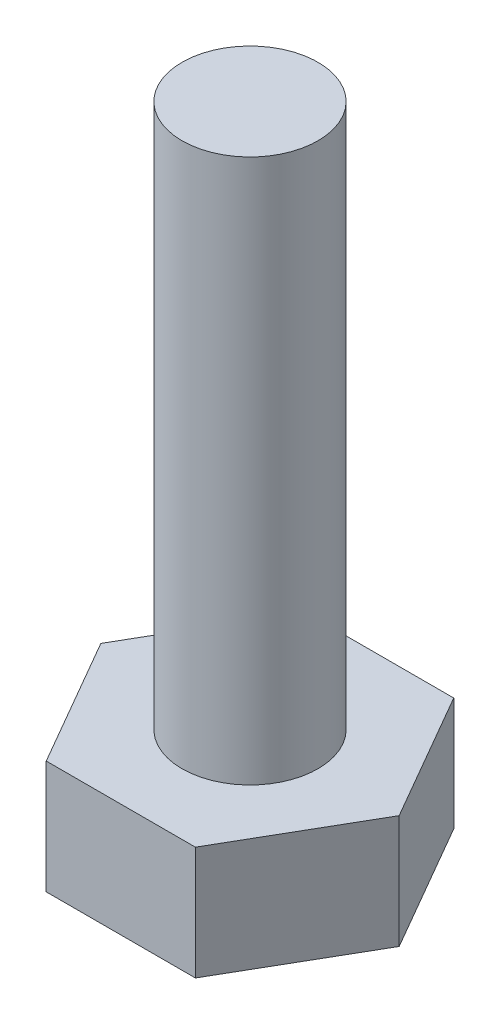
ISO-10303-21;
HEADER;
FILE_DESCRIPTION(('STEP AP214'),'2;1');
FILE_NAME('part.step','',(''),(''),'','','');
FILE_SCHEMA(('AUTOMOTIVE_DESIGN { 1 0 10303 214 1 1 1 1 }'));
ENDSEC;
DATA;
#1=APPLICATION_CONTEXT('core data for automotive mechanical design processes');
#2=APPLICATION_PROTOCOL_DEFINITION('international standard','automotive_design',2000,#1);
#3=PRODUCT_CONTEXT('',#1,'mechanical');
#4=PRODUCT('Part','Part','',(#3));
#5=PRODUCT_RELATED_PRODUCT_CATEGORY('part','',(#4));
#6=PRODUCT_DEFINITION_FORMATION('','',#4);
#7=PRODUCT_DEFINITION_CONTEXT('part definition',#1,'design');
#8=PRODUCT_DEFINITION('design','',#6,#7);
#9=PRODUCT_DEFINITION_SHAPE('','',#8);
#10=(LENGTH_UNIT() NAMED_UNIT(*) SI_UNIT(.MILLI.,.METRE.));
#11=(NAMED_UNIT(*) PLANE_ANGLE_UNIT() SI_UNIT($,.RADIAN.));
#12=(NAMED_UNIT(*) SI_UNIT($,.STERADIAN.) SOLID_ANGLE_UNIT());
#13=UNCERTAINTY_MEASURE_WITH_UNIT(LENGTH_MEASURE(1.E-05),#10,'distance_accuracy_value','');
#14=(GEOMETRIC_REPRESENTATION_CONTEXT(3) GLOBAL_UNCERTAINTY_ASSIGNED_CONTEXT((#13)) GLOBAL_UNIT_ASSIGNED_CONTEXT((#10,
#11,#12)) REPRESENTATION_CONTEXT('',''));
#15=CARTESIAN_POINT('',(0.,0.,0.));
#16=DIRECTION('',(0.,0.,1.));
#17=DIRECTION('',(1.,0.,0.));
#18=AXIS2_PLACEMENT_3D('',#15,#16,#17);
#19=CARTESIAN_POINT('',(1.64544826719047,2.5,2.84999999999998));
#20=DIRECTION('',(-0.866025403784442,0.,-0.499999999999995));
#21=DIRECTION('',(-0.499999999999995,0.,0.866025403784442));
#22=AXIS2_PLACEMENT_3D('',#19,#20,#21);
#23=PLANE('',#22);
#24=DIRECTION('',(0.499999999999995,0.,-0.866025403784441));
#25=VECTOR('',#24,1.);
#26=CARTESIAN_POINT('',(1.64544826719047,0.,2.84999999999998));
#27=LINE('',#26,#25);
#28=CARTESIAN_POINT('',(1.64544826719047,0.,2.84999999999998));
#29=VERTEX_POINT('',#28);
#30=CARTESIAN_POINT('',(3.29089653438087,0.,0.));
#31=VERTEX_POINT('',#30);
#32=EDGE_CURVE('E123',#29,#31,#27,.T.);
#33=ORIENTED_EDGE('',*,*,#32,.T.);
#34=DIRECTION('',(0.,-1.,0.));
#35=VECTOR('',#34,1.);
#36=CARTESIAN_POINT('',(3.29089653438087,2.5,0.));
#37=LINE('',#36,#35);
#38=CARTESIAN_POINT('',(3.29089653438087,2.5,0.));
#39=VERTEX_POINT('',#38);
#40=EDGE_CURVE('E40',#39,#31,#37,.T.);
#41=ORIENTED_EDGE('',*,*,#40,.F.);
#42=DIRECTION('',(0.499999999999995,0.,-0.866025403784441));
#43=VECTOR('',#42,1.);
#44=CARTESIAN_POINT('',(1.64544826719047,2.5,2.84999999999998));
#45=LINE('',#44,#43);
#46=CARTESIAN_POINT('',(1.64544826719047,2.5,2.84999999999998));
#47=VERTEX_POINT('',#46);
#48=EDGE_CURVE('E134',#47,#39,#45,.T.);
#49=ORIENTED_EDGE('',*,*,#48,.F.);
#50=DIRECTION('',(0.,-1.,0.));
#51=VECTOR('',#50,1.);
#52=CARTESIAN_POINT('',(1.64544826719047,2.5,2.84999999999998));
#53=LINE('',#52,#51);
#54=EDGE_CURVE('E119',#47,#29,#53,.T.);
#55=ORIENTED_EDGE('',*,*,#54,.T.);
#56=EDGE_LOOP('',(#33,#41,#49,#55));
#57=FACE_BOUND('',#56,.T.);
#58=ADVANCED_FACE('F37',(#57),#23,.F.);
#59=CARTESIAN_POINT('',(3.29089653438087,2.5,0.));
#60=DIRECTION('',(-0.866025403784438,0.,0.500000000000001));
#61=DIRECTION('',(0.500000000000001,0.,0.866025403784438));
#62=AXIS2_PLACEMENT_3D('',#59,#60,#61);
#63=PLANE('',#62);
#64=DIRECTION('',(-0.500000000000001,0.,-0.866025403784438));
#65=VECTOR('',#64,1.);
#66=CARTESIAN_POINT('',(3.29089653438087,0.,0.));
#67=LINE('',#66,#65);
#68=CARTESIAN_POINT('',(1.64544826719043,0.,-2.85000000000001));
#69=VERTEX_POINT('',#68);
#70=EDGE_CURVE('E126',#31,#69,#67,.T.);
#71=ORIENTED_EDGE('',*,*,#70,.T.);
#72=DIRECTION('',(0.,-1.,0.));
#73=VECTOR('',#72,1.);
#74=CARTESIAN_POINT('',(1.64544826719043,2.5,-2.85000000000001));
#75=LINE('',#74,#73);
#76=CARTESIAN_POINT('',(1.64544826719043,2.5,-2.85000000000001));
#77=VERTEX_POINT('',#76);
#78=EDGE_CURVE('E137',#77,#69,#75,.T.);
#79=ORIENTED_EDGE('',*,*,#78,.F.);
#80=DIRECTION('',(-0.500000000000001,0.,-0.866025403784438));
#81=VECTOR('',#80,1.);
#82=CARTESIAN_POINT('',(3.29089653438087,2.5,0.));
#83=LINE('',#82,#81);
#84=EDGE_CURVE('E92',#39,#77,#83,.T.);
#85=ORIENTED_EDGE('',*,*,#84,.F.);
#86=ORIENTED_EDGE('',*,*,#40,.T.);
#87=EDGE_LOOP('',(#71,#79,#85,#86));
#88=FACE_BOUND('',#87,.T.);
#89=ADVANCED_FACE('F142',(#88),#63,.F.);
#90=CARTESIAN_POINT('',(1.64544826719043,2.5,-2.85000000000001));
#91=DIRECTION('',(0.,0.,1.));
#92=DIRECTION('',(1.,0.,0.));
#93=AXIS2_PLACEMENT_3D('',#90,#91,#92);
#94=PLANE('',#93);
#95=DIRECTION('',(-1.,0.,0.));
#96=VECTOR('',#95,1.);
#97=CARTESIAN_POINT('',(1.64544826719043,0.,-2.85000000000001));
#98=LINE('',#97,#96);
#99=CARTESIAN_POINT('',(-1.64544826719045,0.,-2.84999999999999));
#100=VERTEX_POINT('',#99);
#101=EDGE_CURVE('E129',#69,#100,#98,.T.);
#102=ORIENTED_EDGE('',*,*,#101,.T.);
#103=DIRECTION('',(0.,-1.,0.));
#104=VECTOR('',#103,1.);
#105=CARTESIAN_POINT('',(-1.64544826719045,2.5,-2.84999999999999));
#106=LINE('',#105,#104);
#107=CARTESIAN_POINT('',(-1.64544826719045,2.5,-2.84999999999999));
#108=VERTEX_POINT('',#107);
#109=EDGE_CURVE('E114',#108,#100,#106,.T.);
#110=ORIENTED_EDGE('',*,*,#109,.F.);
#111=DIRECTION('',(-1.,0.,0.));
#112=VECTOR('',#111,1.);
#113=CARTESIAN_POINT('',(1.64544826719043,2.5,-2.85000000000001));
#114=LINE('',#113,#112);
#115=EDGE_CURVE('E105',#77,#108,#114,.T.);
#116=ORIENTED_EDGE('',*,*,#115,.F.);
#117=ORIENTED_EDGE('',*,*,#78,.T.);
#118=EDGE_LOOP('',(#102,#110,#116,#117));
#119=FACE_BOUND('',#118,.T.);
#120=ADVANCED_FACE('F148',(#119),#94,.F.);
#121=CARTESIAN_POINT('',(-1.64544826719045,2.5,-2.84999999999999));
#122=DIRECTION('',(0.866025403784442,0.,0.499999999999995));
#123=DIRECTION('',(0.499999999999995,0.,-0.866025403784442));
#124=AXIS2_PLACEMENT_3D('',#121,#122,#123);
#125=PLANE('',#124);
#126=DIRECTION('',(-0.499999999999995,0.,0.866025403784442));
#127=VECTOR('',#126,1.);
#128=CARTESIAN_POINT('',(-1.64544826719045,0.,-2.84999999999999));
#129=LINE('',#128,#127);
#130=CARTESIAN_POINT('',(-3.29089653438087,0.,0.));
#131=VERTEX_POINT('',#130);
#132=EDGE_CURVE('E113',#100,#131,#129,.T.);
#133=ORIENTED_EDGE('',*,*,#132,.T.);
#134=DIRECTION('',(0.,-1.,0.));
#135=VECTOR('',#134,1.);
#136=CARTESIAN_POINT('',(-3.29089653438087,2.5,0.));
#137=LINE('',#136,#135);
#138=CARTESIAN_POINT('',(-3.29089653438087,2.5,0.));
#139=VERTEX_POINT('',#138);
#140=EDGE_CURVE('E110',#139,#131,#137,.T.);
#141=ORIENTED_EDGE('',*,*,#140,.F.);
#142=DIRECTION('',(-0.499999999999995,0.,0.866025403784442));
#143=VECTOR('',#142,1.);
#144=CARTESIAN_POINT('',(-1.64544826719045,2.5,-2.84999999999999));
#145=LINE('',#144,#143);
#146=EDGE_CURVE('E99',#108,#139,#145,.T.);
#147=ORIENTED_EDGE('',*,*,#146,.F.);
#148=ORIENTED_EDGE('',*,*,#109,.T.);
#149=EDGE_LOOP('',(#133,#141,#147,#148));
#150=FACE_BOUND('',#149,.T.);
#151=ADVANCED_FACE('F111',(#150),#125,.F.);
#152=CARTESIAN_POINT('',(-3.29089653438087,2.5,0.));
#153=DIRECTION('',(0.866025403784434,0.,-0.500000000000007));
#154=DIRECTION('',(-0.500000000000007,0.,-0.866025403784435));
#155=AXIS2_PLACEMENT_3D('',#152,#153,#154);
#156=PLANE('',#155);
#157=DIRECTION('',(0.500000000000007,0.,0.866025403784435));
#158=VECTOR('',#157,1.);
#159=CARTESIAN_POINT('',(-3.29089653438087,0.,0.));
#160=LINE('',#159,#158);
#161=CARTESIAN_POINT('',(-1.64544826719041,0.,2.85000000000002));
#162=VERTEX_POINT('',#161);
#163=EDGE_CURVE('E77',#131,#162,#160,.T.);
#164=ORIENTED_EDGE('',*,*,#163,.T.);
#165=DIRECTION('',(0.,-1.,0.));
#166=VECTOR('',#165,1.);
#167=CARTESIAN_POINT('',(-1.64544826719041,2.5,2.85000000000002));
#168=LINE('',#167,#166);
#169=CARTESIAN_POINT('',(-1.64544826719041,2.5,2.85000000000002));
#170=VERTEX_POINT('',#169);
#171=EDGE_CURVE('E115',#170,#162,#168,.T.);
#172=ORIENTED_EDGE('',*,*,#171,.F.);
#173=DIRECTION('',(0.500000000000007,0.,0.866025403784435));
#174=VECTOR('',#173,1.);
#175=CARTESIAN_POINT('',(-3.29089653438087,2.5,0.));
#176=LINE('',#175,#174);
#177=EDGE_CURVE('E103',#139,#170,#176,.T.);
#178=ORIENTED_EDGE('',*,*,#177,.F.);
#179=ORIENTED_EDGE('',*,*,#140,.T.);
#180=EDGE_LOOP('',(#164,#172,#178,#179));
#181=FACE_BOUND('',#180,.T.);
#182=ADVANCED_FACE('F117',(#181),#156,.F.);
#183=CARTESIAN_POINT('',(-1.64544826719041,2.5,2.85000000000002));
#184=DIRECTION('',(0.,0.,-1.));
#185=DIRECTION('',(-1.,0.,0.));
#186=AXIS2_PLACEMENT_3D('',#183,#184,#185);
#187=PLANE('',#186);
#188=DIRECTION('',(1.,0.,0.));
#189=VECTOR('',#188,1.);
#190=CARTESIAN_POINT('',(-1.64544826719041,0.,2.85000000000002));
#191=LINE('',#190,#189);
#192=EDGE_CURVE('E83',#162,#29,#191,.T.);
#193=ORIENTED_EDGE('',*,*,#192,.T.);
#194=ORIENTED_EDGE('',*,*,#54,.F.);
#195=DIRECTION('',(1.,0.,0.));
#196=VECTOR('',#195,1.);
#197=CARTESIAN_POINT('',(-1.64544826719041,2.5,2.85000000000002));
#198=LINE('',#197,#196);
#199=EDGE_CURVE('E54',#170,#47,#198,.T.);
#200=ORIENTED_EDGE('',*,*,#199,.F.);
#201=ORIENTED_EDGE('',*,*,#171,.T.);
#202=EDGE_LOOP('',(#193,#194,#200,#201));
#203=FACE_BOUND('',#202,.T.);
#204=ADVANCED_FACE('F164',(#203),#187,.F.);
#205=CARTESIAN_POINT('',(0.,2.5,0.));
#206=DIRECTION('',(0.,1.,0.));
#207=DIRECTION('',(0.,0.,1.));
#208=AXIS2_PLACEMENT_3D('',#205,#206,#207);
#209=PLANE('',#208);
#210=CARTESIAN_POINT('',(0.,2.5,0.));
#211=DIRECTION('',(0.,1.,0.));
#212=DIRECTION('',(0.,0.,1.));
#213=AXIS2_PLACEMENT_3D('',#210,#211,#212);
#214=CIRCLE('',#213,1.5);
#215=CARTESIAN_POINT('',(0.,2.5,1.5));
#216=VERTEX_POINT('',#215);
#217=EDGE_CURVE('E11',#216,#216,#214,.T.);
#218=ORIENTED_EDGE('',*,*,#217,.F.);
#219=EDGE_LOOP('',(#218));
#220=FACE_BOUND('',#219,.T.);
#221=ORIENTED_EDGE('',*,*,#48,.T.);
#222=ORIENTED_EDGE('',*,*,#84,.T.);
#223=ORIENTED_EDGE('',*,*,#115,.T.);
#224=ORIENTED_EDGE('',*,*,#146,.T.);
#225=ORIENTED_EDGE('',*,*,#177,.T.);
#226=ORIENTED_EDGE('',*,*,#199,.T.);
#227=EDGE_LOOP('',(#221,#222,#223,#224,#225,#226));
#228=FACE_BOUND('',#227,.T.);
#229=ADVANCED_FACE('F101',(#220,#228),#209,.T.);
#230=CARTESIAN_POINT('',(0.,0.,0.));
#231=DIRECTION('',(0.,1.,0.));
#232=DIRECTION('',(0.,0.,1.));
#233=AXIS2_PLACEMENT_3D('',#230,#231,#232);
#234=PLANE('',#233);
#235=ORIENTED_EDGE('',*,*,#32,.F.);
#236=ORIENTED_EDGE('',*,*,#192,.F.);
#237=ORIENTED_EDGE('',*,*,#163,.F.);
#238=ORIENTED_EDGE('',*,*,#132,.F.);
#239=ORIENTED_EDGE('',*,*,#101,.F.);
#240=ORIENTED_EDGE('',*,*,#70,.F.);
#241=EDGE_LOOP('',(#235,#236,#237,#238,#239,#240));
#242=FACE_BOUND('',#241,.T.);
#243=ADVANCED_FACE('F147',(#242),#234,.F.);
#244=CARTESIAN_POINT('',(0.,14.5,0.));
#245=DIRECTION('',(0.,-1.,0.));
#246=DIRECTION('',(0.,0.,-1.));
#247=AXIS2_PLACEMENT_3D('',#244,#245,#246);
#248=CYLINDRICAL_SURFACE('',#247,1.5);
#249=CARTESIAN_POINT('',(0.,14.5,0.));
#250=DIRECTION('',(0.,1.,0.));
#251=DIRECTION('',(0.,0.,1.));
#252=AXIS2_PLACEMENT_3D('',#249,#250,#251);
#253=CIRCLE('',#252,1.5);
#254=CARTESIAN_POINT('',(0.,14.5,1.5));
#255=VERTEX_POINT('',#254);
#256=EDGE_CURVE('E127',#255,#255,#253,.T.);
#257=ORIENTED_EDGE('',*,*,#256,.F.);
#258=EDGE_LOOP('',(#257));
#259=FACE_BOUND('',#258,.T.);
#260=ORIENTED_EDGE('',*,*,#217,.T.);
#261=EDGE_LOOP('',(#260));
#262=FACE_BOUND('',#261,.T.);
#263=ADVANCED_FACE('F157',(#259,#262),#248,.T.);
#264=CARTESIAN_POINT('',(0.,14.5,0.));
#265=DIRECTION('',(0.,1.,0.));
#266=DIRECTION('',(0.,0.,1.));
#267=AXIS2_PLACEMENT_3D('',#264,#265,#266);
#268=PLANE('',#267);
#269=ORIENTED_EDGE('',*,*,#256,.T.);
#270=EDGE_LOOP('',(#269));
#271=FACE_BOUND('',#270,.T.);
#272=ADVANCED_FACE('F155',(#271),#268,.T.);
#273=CLOSED_SHELL('',(#58,#89,#120,#151,#182,#204,#229,#243,#263,#272));
#274=MANIFOLD_SOLID_BREP('B2',#273);
#275=ADVANCED_BREP_SHAPE_REPRESENTATION('',(#18,#274),#14);
#276=SHAPE_DEFINITION_REPRESENTATION(#9,#275);
ENDSEC;
END-ISO-10303-21;
